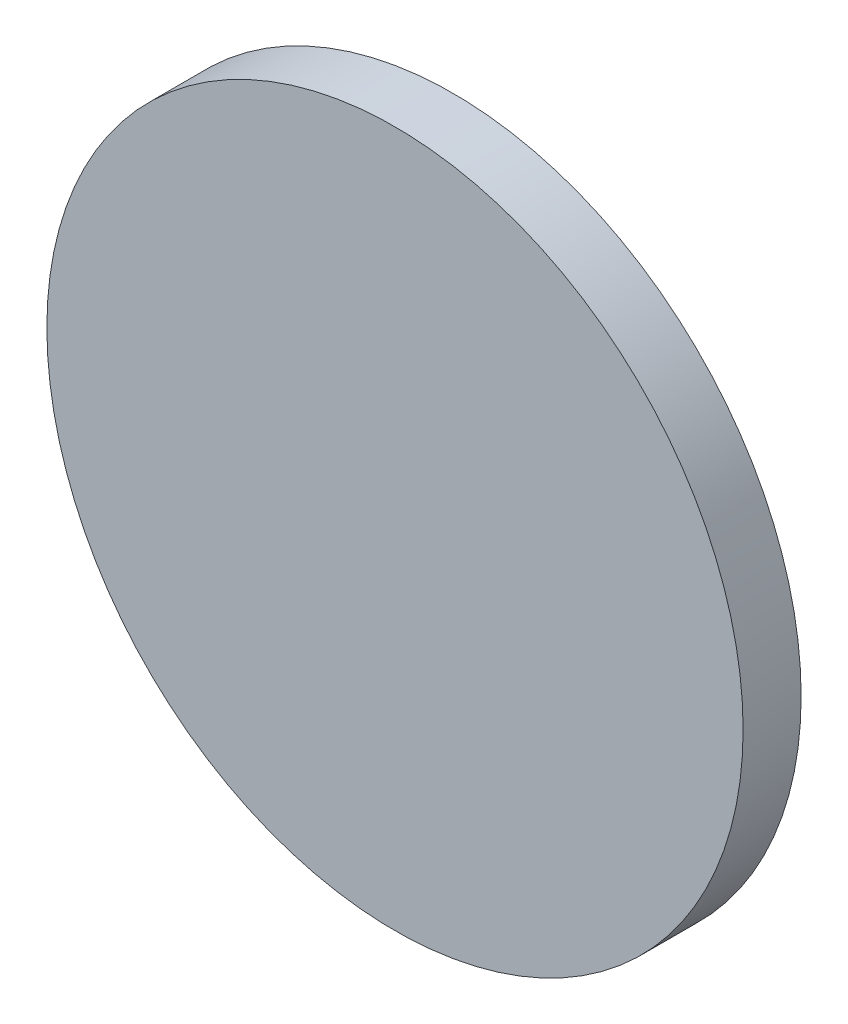
ISO-10303-21;
HEADER;
FILE_DESCRIPTION(('STEP AP214'),'2;1');
FILE_NAME('part.step','',(''),(''),'','','');
FILE_SCHEMA(('AUTOMOTIVE_DESIGN { 1 0 10303 214 1 1 1 1 }'));
ENDSEC;
DATA;
#1=APPLICATION_CONTEXT('core data for automotive mechanical design processes');
#2=APPLICATION_PROTOCOL_DEFINITION('international standard','automotive_design',2000,#1);
#3=PRODUCT_CONTEXT('',#1,'mechanical');
#4=PRODUCT('Part','Part','',(#3));
#5=PRODUCT_RELATED_PRODUCT_CATEGORY('part','',(#4));
#6=PRODUCT_DEFINITION_FORMATION('','',#4);
#7=PRODUCT_DEFINITION_CONTEXT('part definition',#1,'design');
#8=PRODUCT_DEFINITION('design','',#6,#7);
#9=PRODUCT_DEFINITION_SHAPE('','',#8);
#10=(LENGTH_UNIT() NAMED_UNIT(*) SI_UNIT(.MILLI.,.METRE.));
#11=(NAMED_UNIT(*) PLANE_ANGLE_UNIT() SI_UNIT($,.RADIAN.));
#12=(NAMED_UNIT(*) SI_UNIT($,.STERADIAN.) SOLID_ANGLE_UNIT());
#13=UNCERTAINTY_MEASURE_WITH_UNIT(LENGTH_MEASURE(1.E-05),#10,'distance_accuracy_value','');
#14=(GEOMETRIC_REPRESENTATION_CONTEXT(3) GLOBAL_UNCERTAINTY_ASSIGNED_CONTEXT((#13)) GLOBAL_UNIT_ASSIGNED_CONTEXT((#10,
#11,#12)) REPRESENTATION_CONTEXT('',''));
#15=CARTESIAN_POINT('',(0.,0.,0.));
#16=DIRECTION('',(0.,0.,1.));
#17=DIRECTION('',(1.,0.,0.));
#18=AXIS2_PLACEMENT_3D('',#15,#16,#17);
#19=CARTESIAN_POINT('',(0.,0.,6.35));
#20=DIRECTION('',(0.,0.,-1.));
#21=DIRECTION('',(-1.,0.,0.));
#22=AXIS2_PLACEMENT_3D('',#19,#20,#21);
#23=CYLINDRICAL_SURFACE('',#22,38.1);
#24=CARTESIAN_POINT('',(0.,0.,6.35));
#25=DIRECTION('',(0.,0.,1.));
#26=DIRECTION('',(1.,0.,0.));
#27=AXIS2_PLACEMENT_3D('',#24,#25,#26);
#28=CIRCLE('',#27,38.1);
#29=CARTESIAN_POINT('',(38.1,0.,6.35));
#30=VERTEX_POINT('',#29);
#31=EDGE_CURVE('E11',#30,#30,#28,.T.);
#32=ORIENTED_EDGE('',*,*,#31,.F.);
#33=EDGE_LOOP('',(#32));
#34=FACE_BOUND('',#33,.T.);
#35=CARTESIAN_POINT('',(0.,0.,0.));
#36=DIRECTION('',(0.,0.,1.));
#37=DIRECTION('',(1.,0.,0.));
#38=AXIS2_PLACEMENT_3D('',#35,#36,#37);
#39=CIRCLE('',#38,38.1);
#40=CARTESIAN_POINT('',(38.1,0.,0.));
#41=VERTEX_POINT('',#40);
#42=EDGE_CURVE('E46',#41,#41,#39,.T.);
#43=ORIENTED_EDGE('',*,*,#42,.T.);
#44=EDGE_LOOP('',(#43));
#45=FACE_BOUND('',#44,.T.);
#46=ADVANCED_FACE('F43',(#34,#45),#23,.T.);
#47=CARTESIAN_POINT('',(0.,0.,6.35));
#48=DIRECTION('',(0.,0.,1.));
#49=DIRECTION('',(1.,0.,0.));
#50=AXIS2_PLACEMENT_3D('',#47,#48,#49);
#51=PLANE('',#50);
#52=ORIENTED_EDGE('',*,*,#31,.T.);
#53=EDGE_LOOP('',(#52));
#54=FACE_BOUND('',#53,.T.);
#55=ADVANCED_FACE('F134',(#54),#51,.T.);
#56=CARTESIAN_POINT('',(0.,0.,0.));
#57=DIRECTION('',(0.,0.,1.));
#58=DIRECTION('',(1.,0.,0.));
#59=AXIS2_PLACEMENT_3D('',#56,#57,#58);
#60=PLANE('',#59);
#61=DIRECTION('',(-1.,0.,0.));
#62=VECTOR('',#61,1.);
#63=CARTESIAN_POINT('',(10.1,-10.02,0.));
#64=LINE('',#63,#62);
#65=CARTESIAN_POINT('',(10.1,-10.02,0.));
#66=VERTEX_POINT('',#65);
#67=CARTESIAN_POINT('',(-10.1,-10.02,0.));
#68=VERTEX_POINT('',#67);
#69=EDGE_CURVE('E95',#66,#68,#64,.T.);
#70=ORIENTED_EDGE('',*,*,#69,.F.);
#71=DIRECTION('',(0.,-1.,0.));
#72=VECTOR('',#71,1.);
#73=CARTESIAN_POINT('',(10.1,30.02,0.));
#74=LINE('',#73,#72);
#75=CARTESIAN_POINT('',(10.1,30.02,0.));
#76=VERTEX_POINT('',#75);
#77=EDGE_CURVE('E60',#76,#66,#74,.T.);
#78=ORIENTED_EDGE('',*,*,#77,.F.);
#79=DIRECTION('',(1.,0.,0.));
#80=VECTOR('',#79,1.);
#81=CARTESIAN_POINT('',(10.1,30.02,0.));
#82=LINE('',#81,#80);
#83=CARTESIAN_POINT('',(-10.1,30.02,0.));
#84=VERTEX_POINT('',#83);
#85=EDGE_CURVE('E107',#84,#76,#82,.T.);
#86=ORIENTED_EDGE('',*,*,#85,.F.);
#87=DIRECTION('',(0.,1.,0.));
#88=VECTOR('',#87,1.);
#89=CARTESIAN_POINT('',(-10.1,30.02,0.));
#90=LINE('',#89,#88);
#91=EDGE_CURVE('E111',#68,#84,#90,.T.);
#92=ORIENTED_EDGE('',*,*,#91,.F.);
#93=EDGE_LOOP('',(#70,#78,#86,#92));
#94=FACE_BOUND('',#93,.T.);
#95=ORIENTED_EDGE('',*,*,#42,.F.);
#96=EDGE_LOOP('',(#95));
#97=FACE_BOUND('',#96,.T.);
#98=ADVANCED_FACE('F119',(#94,#97),#60,.F.);
#99=CARTESIAN_POINT('',(10.1,30.02,5.3));
#100=DIRECTION('',(1.,0.,0.));
#101=DIRECTION('',(0.,1.,0.));
#102=AXIS2_PLACEMENT_3D('',#99,#100,#101);
#103=PLANE('',#102);
#104=ORIENTED_EDGE('',*,*,#77,.T.);
#105=DIRECTION('',(0.,0.,-1.));
#106=VECTOR('',#105,1.);
#107=CARTESIAN_POINT('',(10.1,-10.02,5.3));
#108=LINE('',#107,#106);
#109=CARTESIAN_POINT('',(10.1,-10.02,5.3));
#110=VERTEX_POINT('',#109);
#111=EDGE_CURVE('E79',#110,#66,#108,.T.);
#112=ORIENTED_EDGE('',*,*,#111,.F.);
#113=DIRECTION('',(0.,-1.,0.));
#114=VECTOR('',#113,1.);
#115=CARTESIAN_POINT('',(10.1,30.02,5.3));
#116=LINE('',#115,#114);
#117=CARTESIAN_POINT('',(10.1,30.02,5.3));
#118=VERTEX_POINT('',#117);
#119=EDGE_CURVE('E106',#118,#110,#116,.T.);
#120=ORIENTED_EDGE('',*,*,#119,.F.);
#121=DIRECTION('',(0.,0.,-1.));
#122=VECTOR('',#121,1.);
#123=CARTESIAN_POINT('',(10.1,30.02,5.3));
#124=LINE('',#123,#122);
#125=EDGE_CURVE('E64',#118,#76,#124,.T.);
#126=ORIENTED_EDGE('',*,*,#125,.T.);
#127=EDGE_LOOP('',(#104,#112,#120,#126));
#128=FACE_BOUND('',#127,.T.);
#129=ADVANCED_FACE('F123',(#128),#103,.F.);
#130=CARTESIAN_POINT('',(10.1,30.02,5.3));
#131=DIRECTION('',(0.,1.,0.));
#132=DIRECTION('',(0.,0.,1.));
#133=AXIS2_PLACEMENT_3D('',#130,#131,#132);
#134=PLANE('',#133);
#135=ORIENTED_EDGE('',*,*,#85,.T.);
#136=ORIENTED_EDGE('',*,*,#125,.F.);
#137=DIRECTION('',(1.,0.,0.));
#138=VECTOR('',#137,1.);
#139=CARTESIAN_POINT('',(10.1,30.02,5.3));
#140=LINE('',#139,#138);
#141=CARTESIAN_POINT('',(-10.1,30.02,5.3));
#142=VERTEX_POINT('',#141);
#143=EDGE_CURVE('E103',#142,#118,#140,.T.);
#144=ORIENTED_EDGE('',*,*,#143,.F.);
#145=DIRECTION('',(0.,0.,-1.));
#146=VECTOR('',#145,1.);
#147=CARTESIAN_POINT('',(-10.1,30.02,5.3));
#148=LINE('',#147,#146);
#149=EDGE_CURVE('E96',#142,#84,#148,.T.);
#150=ORIENTED_EDGE('',*,*,#149,.T.);
#151=EDGE_LOOP('',(#135,#136,#144,#150));
#152=FACE_BOUND('',#151,.T.);
#153=ADVANCED_FACE('F124',(#152),#134,.F.);
#154=CARTESIAN_POINT('',(-10.1,30.02,5.3));
#155=DIRECTION('',(-1.,0.,0.));
#156=DIRECTION('',(0.,-1.,0.));
#157=AXIS2_PLACEMENT_3D('',#154,#155,#156);
#158=PLANE('',#157);
#159=ORIENTED_EDGE('',*,*,#91,.T.);
#160=ORIENTED_EDGE('',*,*,#149,.F.);
#161=DIRECTION('',(0.,1.,0.));
#162=VECTOR('',#161,1.);
#163=CARTESIAN_POINT('',(-10.1,30.02,5.3));
#164=LINE('',#163,#162);
#165=CARTESIAN_POINT('',(-10.1,-10.02,5.3));
#166=VERTEX_POINT('',#165);
#167=EDGE_CURVE('E97',#166,#142,#164,.T.);
#168=ORIENTED_EDGE('',*,*,#167,.F.);
#169=DIRECTION('',(0.,0.,-1.));
#170=VECTOR('',#169,1.);
#171=CARTESIAN_POINT('',(-10.1,-10.02,5.3));
#172=LINE('',#171,#170);
#173=EDGE_CURVE('E83',#166,#68,#172,.T.);
#174=ORIENTED_EDGE('',*,*,#173,.T.);
#175=EDGE_LOOP('',(#159,#160,#168,#174));
#176=FACE_BOUND('',#175,.T.);
#177=ADVANCED_FACE('F99',(#176),#158,.F.);
#178=CARTESIAN_POINT('',(10.1,-10.02,5.3));
#179=DIRECTION('',(0.,-1.,0.));
#180=DIRECTION('',(0.,0.,-1.));
#181=AXIS2_PLACEMENT_3D('',#178,#179,#180);
#182=PLANE('',#181);
#183=ORIENTED_EDGE('',*,*,#69,.T.);
#184=ORIENTED_EDGE('',*,*,#173,.F.);
#185=DIRECTION('',(-1.,0.,0.));
#186=VECTOR('',#185,1.);
#187=CARTESIAN_POINT('',(10.1,-10.02,5.3));
#188=LINE('',#187,#186);
#189=EDGE_CURVE('E90',#110,#166,#188,.T.);
#190=ORIENTED_EDGE('',*,*,#189,.F.);
#191=ORIENTED_EDGE('',*,*,#111,.T.);
#192=EDGE_LOOP('',(#183,#184,#190,#191));
#193=FACE_BOUND('',#192,.T.);
#194=ADVANCED_FACE('F87',(#193),#182,.F.);
#195=CARTESIAN_POINT('',(0.,0.,5.3));
#196=DIRECTION('',(0.,0.,-1.));
#197=DIRECTION('',(-1.,0.,0.));
#198=AXIS2_PLACEMENT_3D('',#195,#196,#197);
#199=PLANE('',#198);
#200=ORIENTED_EDGE('',*,*,#119,.T.);
#201=ORIENTED_EDGE('',*,*,#189,.T.);
#202=ORIENTED_EDGE('',*,*,#167,.T.);
#203=ORIENTED_EDGE('',*,*,#143,.T.);
#204=EDGE_LOOP('',(#200,#201,#202,#203));
#205=FACE_BOUND('',#204,.T.);
#206=ADVANCED_FACE('F104',(#205),#199,.T.);
#207=CLOSED_SHELL('',(#46,#55,#98,#129,#153,#177,#194,#206));
#208=MANIFOLD_SOLID_BREP('B2',#207);
#209=ADVANCED_BREP_SHAPE_REPRESENTATION('',(#18,#208),#14);
#210=SHAPE_DEFINITION_REPRESENTATION(#9,#209);
ENDSEC;
END-ISO-10303-21;
